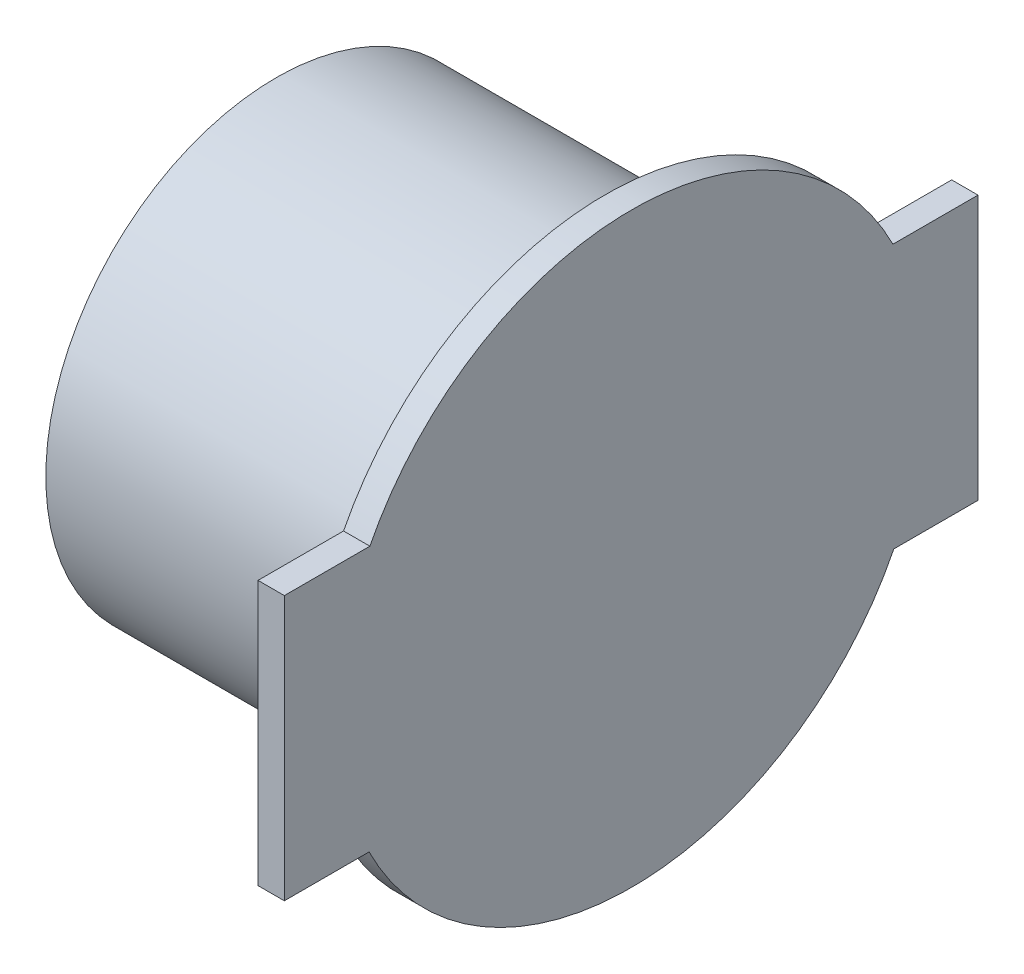
ISO-10303-21;
HEADER;
FILE_DESCRIPTION(('STEP AP214'),'2;1');
FILE_NAME('part.step','',(''),(''),'','','');
FILE_SCHEMA(('AUTOMOTIVE_DESIGN { 1 0 10303 214 1 1 1 1 }'));
ENDSEC;
DATA;
#1=APPLICATION_CONTEXT('core data for automotive mechanical design processes');
#2=APPLICATION_PROTOCOL_DEFINITION('international standard','automotive_design',2000,#1);
#3=PRODUCT_CONTEXT('',#1,'mechanical');
#4=PRODUCT('Part','Part','',(#3));
#5=PRODUCT_RELATED_PRODUCT_CATEGORY('part','',(#4));
#6=PRODUCT_DEFINITION_FORMATION('','',#4);
#7=PRODUCT_DEFINITION_CONTEXT('part definition',#1,'design');
#8=PRODUCT_DEFINITION('design','',#6,#7);
#9=PRODUCT_DEFINITION_SHAPE('','',#8);
#10=(LENGTH_UNIT() NAMED_UNIT(*) SI_UNIT(.MILLI.,.METRE.));
#11=(NAMED_UNIT(*) PLANE_ANGLE_UNIT() SI_UNIT($,.RADIAN.));
#12=(NAMED_UNIT(*) SI_UNIT($,.STERADIAN.) SOLID_ANGLE_UNIT());
#13=UNCERTAINTY_MEASURE_WITH_UNIT(LENGTH_MEASURE(1.E-05),#10,'distance_accuracy_value','');
#14=(GEOMETRIC_REPRESENTATION_CONTEXT(3) GLOBAL_UNCERTAINTY_ASSIGNED_CONTEXT((#13)) GLOBAL_UNIT_ASSIGNED_CONTEXT((#10,
#11,#12)) REPRESENTATION_CONTEXT('',''));
#15=CARTESIAN_POINT('',(0.,0.,0.));
#16=DIRECTION('',(0.,0.,1.));
#17=DIRECTION('',(1.,0.,0.));
#18=AXIS2_PLACEMENT_3D('',#15,#16,#17);
#19=CARTESIAN_POINT('',(25.,0.,0.));
#20=DIRECTION('',(-1.,0.,0.));
#21=DIRECTION('',(0.,0.,1.));
#22=AXIS2_PLACEMENT_3D('',#19,#20,#21);
#23=CYLINDRICAL_SURFACE('',#22,17.5);
#24=CARTESIAN_POINT('',(25.,0.,0.));
#25=DIRECTION('',(1.,0.,0.));
#26=DIRECTION('',(0.,0.,-1.));
#27=AXIS2_PLACEMENT_3D('',#24,#25,#26);
#28=CIRCLE('',#27,17.5);
#29=CARTESIAN_POINT('',(25.,0.,-17.5));
#30=VERTEX_POINT('',#29);
#31=EDGE_CURVE('E11',#30,#30,#28,.T.);
#32=ORIENTED_EDGE('',*,*,#31,.F.);
#33=EDGE_LOOP('',(#32));
#34=FACE_BOUND('',#33,.T.);
#35=CARTESIAN_POINT('',(0.,0.,0.));
#36=DIRECTION('',(1.,0.,0.));
#37=DIRECTION('',(0.,0.,-1.));
#38=AXIS2_PLACEMENT_3D('',#35,#36,#37);
#39=CIRCLE('',#38,17.5);
#40=CARTESIAN_POINT('',(0.,0.,-17.5));
#41=VERTEX_POINT('',#40);
#42=EDGE_CURVE('E40',#41,#41,#39,.T.);
#43=ORIENTED_EDGE('',*,*,#42,.T.);
#44=EDGE_LOOP('',(#43));
#45=FACE_BOUND('',#44,.T.);
#46=ADVANCED_FACE('F37',(#34,#45),#23,.T.);
#47=CARTESIAN_POINT('',(0.,0.,0.));
#48=DIRECTION('',(1.,0.,0.));
#49=DIRECTION('',(0.,0.,-1.));
#50=AXIS2_PLACEMENT_3D('',#47,#48,#49);
#51=PLANE('',#50);
#52=ORIENTED_EDGE('',*,*,#42,.F.);
#53=EDGE_LOOP('',(#52));
#54=FACE_BOUND('',#53,.T.);
#55=ADVANCED_FACE('F171',(#54),#51,.F.);
#56=CARTESIAN_POINT('',(27.,0.,0.));
#57=DIRECTION('',(-1.,0.,0.));
#58=DIRECTION('',(0.,0.,1.));
#59=AXIS2_PLACEMENT_3D('',#56,#57,#58);
#60=CYLINDRICAL_SURFACE('',#59,22.2963171416484);
#61=CARTESIAN_POINT('',(25.,0.,0.));
#62=DIRECTION('',(1.,0.,0.));
#63=DIRECTION('',(0.,0.,-1.));
#64=AXIS2_PLACEMENT_3D('',#61,#62,#63);
#65=CIRCLE('',#64,22.2963171416484);
#66=CARTESIAN_POINT('',(25.,10.1054069967131,-19.8747706279027));
#67=VERTEX_POINT('',#66);
#68=CARTESIAN_POINT('',(25.,10.1054069967131,19.8747706279027));
#69=VERTEX_POINT('',#68);
#70=EDGE_CURVE('E134',#67,#69,#65,.T.);
#71=ORIENTED_EDGE('',*,*,#70,.T.);
#72=DIRECTION('',(-1.,0.,0.));
#73=VECTOR('',#72,1.);
#74=CARTESIAN_POINT('',(27.,10.1054069967131,19.8747706279027));
#75=LINE('',#74,#73);
#76=CARTESIAN_POINT('',(27.,10.1054069967131,19.8747706279027));
#77=VERTEX_POINT('',#76);
#78=EDGE_CURVE('E165',#77,#69,#75,.T.);
#79=ORIENTED_EDGE('',*,*,#78,.F.);
#80=CARTESIAN_POINT('',(27.,0.,0.));
#81=DIRECTION('',(1.,0.,0.));
#82=DIRECTION('',(0.,0.,-1.));
#83=AXIS2_PLACEMENT_3D('',#80,#81,#82);
#84=CIRCLE('',#83,22.2963171416484);
#85=CARTESIAN_POINT('',(27.,10.1054069967131,-19.8747706279027));
#86=VERTEX_POINT('',#85);
#87=EDGE_CURVE('E152',#86,#77,#84,.T.);
#88=ORIENTED_EDGE('',*,*,#87,.F.);
#89=DIRECTION('',(-1.,0.,0.));
#90=VECTOR('',#89,1.);
#91=CARTESIAN_POINT('',(27.,10.1054069967131,-19.8747706279027));
#92=LINE('',#91,#90);
#93=EDGE_CURVE('E130',#86,#67,#92,.T.);
#94=ORIENTED_EDGE('',*,*,#93,.T.);
#95=EDGE_LOOP('',(#71,#79,#88,#94));
#96=FACE_BOUND('',#95,.T.);
#97=ADVANCED_FACE('F173',(#96),#60,.T.);
#98=CARTESIAN_POINT('',(27.,10.1054069967131,22.2963171416484));
#99=DIRECTION('',(0.,-1.,0.));
#100=DIRECTION('',(0.,0.,-1.));
#101=AXIS2_PLACEMENT_3D('',#98,#99,#100);
#102=PLANE('',#101);
#103=DIRECTION('',(0.,0.,1.));
#104=VECTOR('',#103,1.);
#105=CARTESIAN_POINT('',(25.,10.1054069967131,22.2963171416484));
#106=LINE('',#105,#104);
#107=CARTESIAN_POINT('',(25.,10.1054069967131,26.3748707034134));
#108=VERTEX_POINT('',#107);
#109=EDGE_CURVE('E137',#69,#108,#106,.T.);
#110=ORIENTED_EDGE('',*,*,#109,.T.);
#111=DIRECTION('',(-1.,0.,0.));
#112=VECTOR('',#111,1.);
#113=CARTESIAN_POINT('',(27.,10.1054069967131,26.3748707034134));
#114=LINE('',#113,#112);
#115=CARTESIAN_POINT('',(27.,10.1054069967131,26.3748707034134));
#116=VERTEX_POINT('',#115);
#117=EDGE_CURVE('E162',#116,#108,#114,.T.);
#118=ORIENTED_EDGE('',*,*,#117,.F.);
#119=DIRECTION('',(0.,0.,1.));
#120=VECTOR('',#119,1.);
#121=CARTESIAN_POINT('',(27.,10.1054069967131,22.2963171416484));
#122=LINE('',#121,#120);
#123=EDGE_CURVE('E94',#77,#116,#122,.T.);
#124=ORIENTED_EDGE('',*,*,#123,.F.);
#125=ORIENTED_EDGE('',*,*,#78,.T.);
#126=EDGE_LOOP('',(#110,#118,#124,#125));
#127=FACE_BOUND('',#126,.T.);
#128=ADVANCED_FACE('F178',(#127),#102,.F.);
#129=CARTESIAN_POINT('',(27.,0.,26.3748707034134));
#130=DIRECTION('',(0.,0.,-1.));
#131=DIRECTION('',(-1.,0.,0.));
#132=AXIS2_PLACEMENT_3D('',#129,#130,#131);
#133=PLANE('',#132);
#134=DIRECTION('',(0.,-1.,0.));
#135=VECTOR('',#134,1.);
#136=CARTESIAN_POINT('',(25.,0.,26.3748707034134));
#137=LINE('',#136,#135);
#138=CARTESIAN_POINT('',(25.,-9.98295184020219,26.3748707034134));
#139=VERTEX_POINT('',#138);
#140=EDGE_CURVE('E140',#108,#139,#137,.T.);
#141=ORIENTED_EDGE('',*,*,#140,.T.);
#142=DIRECTION('',(-1.,0.,0.));
#143=VECTOR('',#142,1.);
#144=CARTESIAN_POINT('',(27.,-9.98295184020219,26.3748707034134));
#145=LINE('',#144,#143);
#146=CARTESIAN_POINT('',(27.,-9.98295184020219,26.3748707034134));
#147=VERTEX_POINT('',#146);
#148=EDGE_CURVE('E159',#147,#139,#145,.T.);
#149=ORIENTED_EDGE('',*,*,#148,.F.);
#150=DIRECTION('',(0.,-1.,0.));
#151=VECTOR('',#150,1.);
#152=CARTESIAN_POINT('',(27.,0.,26.3748707034134));
#153=LINE('',#152,#151);
#154=EDGE_CURVE('E300',#116,#147,#153,.T.);
#155=ORIENTED_EDGE('',*,*,#154,.F.);
#156=ORIENTED_EDGE('',*,*,#117,.T.);
#157=EDGE_LOOP('',(#141,#149,#155,#156));
#158=FACE_BOUND('',#157,.T.);
#159=ADVANCED_FACE('F185',(#158),#133,.F.);
#160=CARTESIAN_POINT('',(27.,-9.98295184020219,22.2963171416484));
#161=DIRECTION('',(0.,1.,0.));
#162=DIRECTION('',(0.,0.,1.));
#163=AXIS2_PLACEMENT_3D('',#160,#161,#162);
#164=PLANE('',#163);
#165=DIRECTION('',(0.,0.,-1.));
#166=VECTOR('',#165,1.);
#167=CARTESIAN_POINT('',(25.,-9.98295184020219,22.2963171416484));
#168=LINE('',#167,#166);
#169=CARTESIAN_POINT('',(25.,-9.98295184020219,19.9365601505667));
#170=VERTEX_POINT('',#169);
#171=EDGE_CURVE('E143',#139,#170,#168,.T.);
#172=ORIENTED_EDGE('',*,*,#171,.T.);
#173=DIRECTION('',(-1.,0.,0.));
#174=VECTOR('',#173,1.);
#175=CARTESIAN_POINT('',(27.,-9.98295184020219,19.9365601505667));
#176=LINE('',#175,#174);
#177=CARTESIAN_POINT('',(27.,-9.98295184020219,19.9365601505667));
#178=VERTEX_POINT('',#177);
#179=EDGE_CURVE('E156',#178,#170,#176,.T.);
#180=ORIENTED_EDGE('',*,*,#179,.F.);
#181=DIRECTION('',(0.,0.,-1.));
#182=VECTOR('',#181,1.);
#183=CARTESIAN_POINT('',(27.,-9.98295184020219,22.2963171416484));
#184=LINE('',#183,#182);
#185=EDGE_CURVE('E304',#147,#178,#184,.T.);
#186=ORIENTED_EDGE('',*,*,#185,.F.);
#187=ORIENTED_EDGE('',*,*,#148,.T.);
#188=EDGE_LOOP('',(#172,#180,#186,#187));
#189=FACE_BOUND('',#188,.T.);
#190=ADVANCED_FACE('F188',(#189),#164,.F.);
#191=CARTESIAN_POINT('',(27.,0.,0.));
#192=DIRECTION('',(-1.,0.,0.));
#193=DIRECTION('',(0.,0.,1.));
#194=AXIS2_PLACEMENT_3D('',#191,#192,#193);
#195=CYLINDRICAL_SURFACE('',#194,22.2963171416484);
#196=CARTESIAN_POINT('',(25.,0.,0.));
#197=DIRECTION('',(1.,0.,0.));
#198=DIRECTION('',(0.,0.,-1.));
#199=AXIS2_PLACEMENT_3D('',#196,#197,#198);
#200=CIRCLE('',#199,22.2963171416484);
#201=CARTESIAN_POINT('',(25.,-9.98295184020219,-19.9365601505667));
#202=VERTEX_POINT('',#201);
#203=EDGE_CURVE('E145',#170,#202,#200,.T.);
#204=ORIENTED_EDGE('',*,*,#203,.T.);
#205=DIRECTION('',(-1.,0.,0.));
#206=VECTOR('',#205,1.);
#207=CARTESIAN_POINT('',(27.,-9.98295184020219,-19.9365601505667));
#208=LINE('',#207,#206);
#209=CARTESIAN_POINT('',(27.,-9.98295184020219,-19.9365601505667));
#210=VERTEX_POINT('',#209);
#211=EDGE_CURVE('E125',#210,#202,#208,.T.);
#212=ORIENTED_EDGE('',*,*,#211,.F.);
#213=CARTESIAN_POINT('',(27.,0.,0.));
#214=DIRECTION('',(1.,0.,0.));
#215=DIRECTION('',(0.,0.,-1.));
#216=AXIS2_PLACEMENT_3D('',#213,#214,#215);
#217=CIRCLE('',#216,22.2963171416484);
#218=EDGE_CURVE('E114',#178,#210,#217,.T.);
#219=ORIENTED_EDGE('',*,*,#218,.F.);
#220=ORIENTED_EDGE('',*,*,#179,.T.);
#221=EDGE_LOOP('',(#204,#212,#219,#220));
#222=FACE_BOUND('',#221,.T.);
#223=ADVANCED_FACE('F192',(#222),#195,.T.);
#224=CARTESIAN_POINT('',(27.,-9.98295184020219,-22.2963171416484));
#225=DIRECTION('',(0.,1.,0.));
#226=DIRECTION('',(0.,0.,1.));
#227=AXIS2_PLACEMENT_3D('',#224,#225,#226);
#228=PLANE('',#227);
#229=DIRECTION('',(0.,0.,-1.));
#230=VECTOR('',#229,1.);
#231=CARTESIAN_POINT('',(25.,-9.98295184020219,-22.2963171416484));
#232=LINE('',#231,#230);
#233=CARTESIAN_POINT('',(25.,-9.98295184020219,-26.3343021727609));
#234=VERTEX_POINT('',#233);
#235=EDGE_CURVE('E123',#202,#234,#232,.T.);
#236=ORIENTED_EDGE('',*,*,#235,.T.);
#237=DIRECTION('',(-1.,0.,0.));
#238=VECTOR('',#237,1.);
#239=CARTESIAN_POINT('',(27.,-9.98295184020219,-26.3343021727609));
#240=LINE('',#239,#238);
#241=CARTESIAN_POINT('',(27.,-9.98295184020219,-26.3343021727609));
#242=VERTEX_POINT('',#241);
#243=EDGE_CURVE('E121',#242,#234,#240,.T.);
#244=ORIENTED_EDGE('',*,*,#243,.F.);
#245=DIRECTION('',(0.,0.,-1.));
#246=VECTOR('',#245,1.);
#247=CARTESIAN_POINT('',(27.,-9.98295184020219,-19.9365601505667));
#248=LINE('',#247,#246);
#249=EDGE_CURVE('E107',#210,#242,#248,.T.);
#250=ORIENTED_EDGE('',*,*,#249,.F.);
#251=ORIENTED_EDGE('',*,*,#211,.T.);
#252=EDGE_LOOP('',(#236,#244,#250,#251));
#253=FACE_BOUND('',#252,.T.);
#254=ADVANCED_FACE('F122',(#253),#228,.F.);
#255=CARTESIAN_POINT('',(27.,0.,-26.3343021727609));
#256=DIRECTION('',(0.,0.,1.));
#257=DIRECTION('',(1.,0.,0.));
#258=AXIS2_PLACEMENT_3D('',#255,#256,#257);
#259=PLANE('',#258);
#260=DIRECTION('',(0.,1.,0.));
#261=VECTOR('',#260,1.);
#262=CARTESIAN_POINT('',(25.,0.,-26.3343021727609));
#263=LINE('',#262,#261);
#264=CARTESIAN_POINT('',(25.,10.1054069967131,-26.3343021727609));
#265=VERTEX_POINT('',#264);
#266=EDGE_CURVE('E149',#234,#265,#263,.T.);
#267=ORIENTED_EDGE('',*,*,#266,.T.);
#268=DIRECTION('',(-1.,0.,0.));
#269=VECTOR('',#268,1.);
#270=CARTESIAN_POINT('',(27.,10.1054069967131,-26.3343021727609));
#271=LINE('',#270,#269);
#272=CARTESIAN_POINT('',(27.,10.1054069967131,-26.3343021727609));
#273=VERTEX_POINT('',#272);
#274=EDGE_CURVE('E126',#273,#265,#271,.T.);
#275=ORIENTED_EDGE('',*,*,#274,.F.);
#276=DIRECTION('',(0.,1.,0.));
#277=VECTOR('',#276,1.);
#278=CARTESIAN_POINT('',(27.,0.,-26.3343021727609));
#279=LINE('',#278,#277);
#280=EDGE_CURVE('E111',#242,#273,#279,.T.);
#281=ORIENTED_EDGE('',*,*,#280,.F.);
#282=ORIENTED_EDGE('',*,*,#243,.T.);
#283=EDGE_LOOP('',(#267,#275,#281,#282));
#284=FACE_BOUND('',#283,.T.);
#285=ADVANCED_FACE('F128',(#284),#259,.F.);
#286=CARTESIAN_POINT('',(27.,10.1054069967131,-22.2963171416484));
#287=DIRECTION('',(0.,-1.,0.));
#288=DIRECTION('',(0.,0.,-1.));
#289=AXIS2_PLACEMENT_3D('',#286,#287,#288);
#290=PLANE('',#289);
#291=DIRECTION('',(0.,0.,1.));
#292=VECTOR('',#291,1.);
#293=CARTESIAN_POINT('',(25.,10.1054069967131,-22.2963171416484));
#294=LINE('',#293,#292);
#295=EDGE_CURVE('E81',#265,#67,#294,.T.);
#296=ORIENTED_EDGE('',*,*,#295,.T.);
#297=ORIENTED_EDGE('',*,*,#93,.F.);
#298=DIRECTION('',(0.,0.,1.));
#299=VECTOR('',#298,1.);
#300=CARTESIAN_POINT('',(27.,10.1054069967131,-22.2963171416484));
#301=LINE('',#300,#299);
#302=EDGE_CURVE('E53',#273,#86,#301,.T.);
#303=ORIENTED_EDGE('',*,*,#302,.F.);
#304=ORIENTED_EDGE('',*,*,#274,.T.);
#305=EDGE_LOOP('',(#296,#297,#303,#304));
#306=FACE_BOUND('',#305,.T.);
#307=ADVANCED_FACE('F201',(#306),#290,.F.);
#308=CARTESIAN_POINT('',(27.,0.,0.));
#309=DIRECTION('',(1.,0.,0.));
#310=DIRECTION('',(0.,0.,-1.));
#311=AXIS2_PLACEMENT_3D('',#308,#309,#310);
#312=PLANE('',#311);
#313=ORIENTED_EDGE('',*,*,#87,.T.);
#314=ORIENTED_EDGE('',*,*,#123,.T.);
#315=ORIENTED_EDGE('',*,*,#154,.T.);
#316=ORIENTED_EDGE('',*,*,#185,.T.);
#317=ORIENTED_EDGE('',*,*,#218,.T.);
#318=ORIENTED_EDGE('',*,*,#249,.T.);
#319=ORIENTED_EDGE('',*,*,#280,.T.);
#320=ORIENTED_EDGE('',*,*,#302,.T.);
#321=EDGE_LOOP('',(#313,#314,#315,#316,#317,#318,#319,#320));
#322=FACE_BOUND('',#321,.T.);
#323=ADVANCED_FACE('F109',(#322),#312,.T.);
#324=CARTESIAN_POINT('',(25.,0.,0.));
#325=DIRECTION('',(1.,0.,0.));
#326=DIRECTION('',(0.,0.,-1.));
#327=AXIS2_PLACEMENT_3D('',#324,#325,#326);
#328=PLANE('',#327);
#329=ORIENTED_EDGE('',*,*,#31,.T.);
#330=EDGE_LOOP('',(#329));
#331=FACE_BOUND('',#330,.T.);
#332=ORIENTED_EDGE('',*,*,#70,.F.);
#333=ORIENTED_EDGE('',*,*,#295,.F.);
#334=ORIENTED_EDGE('',*,*,#266,.F.);
#335=ORIENTED_EDGE('',*,*,#235,.F.);
#336=ORIENTED_EDGE('',*,*,#203,.F.);
#337=ORIENTED_EDGE('',*,*,#171,.F.);
#338=ORIENTED_EDGE('',*,*,#140,.F.);
#339=ORIENTED_EDGE('',*,*,#109,.F.);
#340=EDGE_LOOP('',(#332,#333,#334,#335,#336,#337,#338,#339));
#341=FACE_BOUND('',#340,.T.);
#342=ADVANCED_FACE('F204',(#331,#341),#328,.F.);
#343=CLOSED_SHELL('',(#46,#55,#97,#128,#159,#190,#223,#254,#285,#307,#323,#342));
#344=MANIFOLD_SOLID_BREP('B2',#343);
#345=ADVANCED_BREP_SHAPE_REPRESENTATION('',(#18,#344),#14);
#346=SHAPE_DEFINITION_REPRESENTATION(#9,#345);
ENDSEC;
END-ISO-10303-21;
